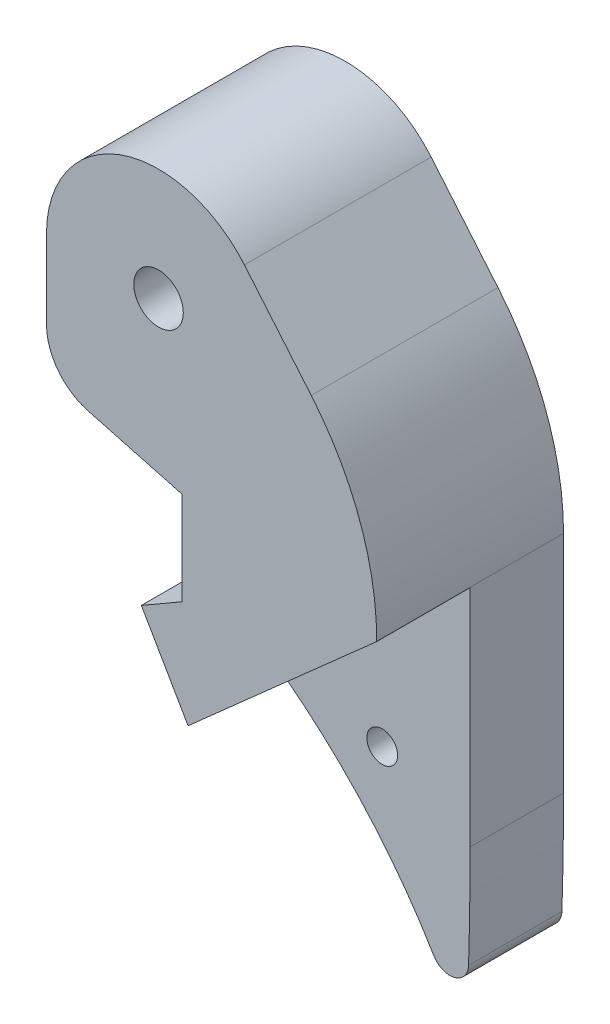
ISO-10303-21;
HEADER;
FILE_DESCRIPTION(('STEP AP214'),'2;1');
FILE_NAME('part.step','',(''),(''),'','','');
FILE_SCHEMA(('AUTOMOTIVE_DESIGN { 1 0 10303 214 1 1 1 1 }'));
ENDSEC;
DATA;
#1=APPLICATION_CONTEXT('core data for automotive mechanical design processes');
#2=APPLICATION_PROTOCOL_DEFINITION('international standard','automotive_design',2000,#1);
#3=PRODUCT_CONTEXT('',#1,'mechanical');
#4=PRODUCT('Part','Part','',(#3));
#5=PRODUCT_RELATED_PRODUCT_CATEGORY('part','',(#4));
#6=PRODUCT_DEFINITION_FORMATION('','',#4);
#7=PRODUCT_DEFINITION_CONTEXT('part definition',#1,'design');
#8=PRODUCT_DEFINITION('design','',#6,#7);
#9=PRODUCT_DEFINITION_SHAPE('','',#8);
#10=(LENGTH_UNIT() NAMED_UNIT(*) SI_UNIT(.MILLI.,.METRE.));
#11=(NAMED_UNIT(*) PLANE_ANGLE_UNIT() SI_UNIT($,.RADIAN.));
#12=(NAMED_UNIT(*) SI_UNIT($,.STERADIAN.) SOLID_ANGLE_UNIT());
#13=UNCERTAINTY_MEASURE_WITH_UNIT(LENGTH_MEASURE(1.E-05),#10,'distance_accuracy_value','');
#14=(GEOMETRIC_REPRESENTATION_CONTEXT(3) GLOBAL_UNCERTAINTY_ASSIGNED_CONTEXT((#13)) GLOBAL_UNIT_ASSIGNED_CONTEXT((#10,
#11,#12)) REPRESENTATION_CONTEXT('',''));
#15=CARTESIAN_POINT('',(0.,0.,0.));
#16=DIRECTION('',(0.,0.,1.));
#17=DIRECTION('',(1.,0.,0.));
#18=AXIS2_PLACEMENT_3D('',#15,#16,#17);
#19=CARTESIAN_POINT('',(-22.7858285918169,-75.5525852744783,20.));
#20=DIRECTION('',(0.,0.,-1.));
#21=DIRECTION('',(-1.,0.,0.));
#22=AXIS2_PLACEMENT_3D('',#19,#20,#21);
#23=CYLINDRICAL_SURFACE('',#22,63.1748093339037);
#24=CARTESIAN_POINT('',(-22.7858285918169,-75.5525852744783,0.));
#25=DIRECTION('',(0.,0.,-1.));
#26=DIRECTION('',(-1.,0.,0.));
#27=AXIS2_PLACEMENT_3D('',#24,#25,#26);
#28=CIRCLE('',#27,63.1748093339037);
#29=CARTESIAN_POINT('',(15.1587603754139,-25.0425397143821,0.));
#30=VERTEX_POINT('',#29);
#31=CARTESIAN_POINT('',(31.4788245209,-43.2044175221683,0.));
#32=VERTEX_POINT('',#31);
#33=EDGE_CURVE('E205',#30,#32,#28,.T.);
#34=ORIENTED_EDGE('',*,*,#33,.T.);
#35=DIRECTION('',(0.,0.,-1.));
#36=VECTOR('',#35,1.);
#37=CARTESIAN_POINT('',(31.4788245209,-43.2044175221683,20.));
#38=LINE('',#37,#36);
#39=CARTESIAN_POINT('',(31.4788245209,-43.2044175221683,10.));
#40=VERTEX_POINT('',#39);
#41=EDGE_CURVE('E238',#32,#40,#38,.F.);
#42=ORIENTED_EDGE('',*,*,#41,.T.);
#43=CARTESIAN_POINT('',(-22.7858285918169,-75.5525852744783,10.));
#44=DIRECTION('',(0.,0.,1.));
#45=DIRECTION('',(1.,0.,0.));
#46=AXIS2_PLACEMENT_3D('',#43,#44,#45);
#47=CIRCLE('',#46,63.1748093339037);
#48=CARTESIAN_POINT('',(15.1587603754139,-25.0425397143821,10.));
#49=VERTEX_POINT('',#48);
#50=EDGE_CURVE('E167',#49,#40,#47,.F.);
#51=ORIENTED_EDGE('',*,*,#50,.F.);
#52=DIRECTION('',(0.,0.,-1.));
#53=VECTOR('',#52,1.);
#54=CARTESIAN_POINT('',(15.1587603754139,-25.0425397143821,20.));
#55=LINE('',#54,#53);
#56=EDGE_CURVE('E224',#49,#30,#55,.T.);
#57=ORIENTED_EDGE('',*,*,#56,.T.);
#58=EDGE_LOOP('',(#34,#42,#51,#57));
#59=FACE_BOUND('',#58,.T.);
#60=ADVANCED_FACE('F34',(#59),#23,.F.);
#61=CARTESIAN_POINT('',(-325.086787377841,-31.1774179561002,20.));
#62=DIRECTION('',(0.,0.,-1.));
#63=DIRECTION('',(-1.,0.,0.));
#64=AXIS2_PLACEMENT_3D('',#61,#62,#63);
#65=CYLINDRICAL_SURFACE('',#64,360.452442871952);
#66=CARTESIAN_POINT('',(-325.086787377841,-31.1774179561002,10.));
#67=DIRECTION('',(0.,0.,1.));
#68=DIRECTION('',(1.,0.,0.));
#69=AXIS2_PLACEMENT_3D('',#66,#67,#68);
#70=CIRCLE('',#69,360.452442871952);
#71=CARTESIAN_POINT('',(35.1958026765203,-42.2417243545552,10.));
#72=VERTEX_POINT('',#71);
#73=CARTESIAN_POINT('',(35.3656554941111,-31.1774179561002,10.));
#74=VERTEX_POINT('',#73);
#75=EDGE_CURVE('E145',#72,#74,#70,.T.);
#76=ORIENTED_EDGE('',*,*,#75,.F.);
#77=DIRECTION('',(0.,0.,-1.));
#78=VECTOR('',#77,1.);
#79=CARTESIAN_POINT('',(35.1958026765204,-42.2417243545552,20.));
#80=LINE('',#79,#78);
#81=CARTESIAN_POINT('',(35.1958026765203,-42.2417243545552,0.));
#82=VERTEX_POINT('',#81);
#83=EDGE_CURVE('E150',#72,#82,#80,.T.);
#84=ORIENTED_EDGE('',*,*,#83,.T.);
#85=CARTESIAN_POINT('',(-325.086787377841,-31.1774179561002,0.));
#86=DIRECTION('',(0.,0.,1.));
#87=DIRECTION('',(1.,0.,0.));
#88=AXIS2_PLACEMENT_3D('',#85,#86,#87);
#89=CIRCLE('',#88,360.452442871952);
#90=CARTESIAN_POINT('',(35.3656554941111,-31.1774179561002,0.));
#91=VERTEX_POINT('',#90);
#92=EDGE_CURVE('E208',#82,#91,#89,.T.);
#93=ORIENTED_EDGE('',*,*,#92,.T.);
#94=DIRECTION('',(0.,0.,-1.));
#95=VECTOR('',#94,1.);
#96=CARTESIAN_POINT('',(35.3656554941111,-31.1774179561002,20.));
#97=LINE('',#96,#95);
#98=EDGE_CURVE('E222',#74,#91,#97,.T.);
#99=ORIENTED_EDGE('',*,*,#98,.F.);
#100=EDGE_LOOP('',(#76,#84,#93,#99));
#101=FACE_BOUND('',#100,.T.);
#102=ADVANCED_FACE('F284',(#101),#65,.T.);
#103=CARTESIAN_POINT('',(-22.7858285918169,-75.5525852744783,20.));
#104=DIRECTION('',(0.,0.,-1.));
#105=DIRECTION('',(-1.,0.,0.));
#106=AXIS2_PLACEMENT_3D('',#103,#104,#105);
#107=PLANE('',#106);
#108=DIRECTION('',(0.,-1.,0.));
#109=VECTOR('',#108,1.);
#110=CARTESIAN_POINT('',(0.,0.,20.));
#111=LINE('',#110,#109);
#112=CARTESIAN_POINT('',(0.,13.,20.));
#113=VERTEX_POINT('',#112);
#114=CARTESIAN_POINT('',(0.,4.60396192787378,20.));
#115=VERTEX_POINT('',#114);
#116=EDGE_CURVE('E194',#113,#115,#111,.T.);
#117=ORIENTED_EDGE('',*,*,#116,.T.);
#118=CARTESIAN_POINT('',(6.,4.60396192787378,20.));
#119=DIRECTION('',(0.,0.,-1.));
#120=DIRECTION('',(-1.,0.,0.));
#121=AXIS2_PLACEMENT_3D('',#118,#119,#120);
#122=CIRCLE('',#121,6.);
#123=CARTESIAN_POINT('',(4.4470857293849,-1.19159302986064,20.));
#124=VERTEX_POINT('',#123);
#125=EDGE_CURVE('E11',#115,#124,#122,.F.);
#126=ORIENTED_EDGE('',*,*,#125,.T.);
#127=DIRECTION('',(0.965925826289069,-0.258819045102518,0.));
#128=VECTOR('',#127,1.);
#129=CARTESIAN_POINT('',(0.,0.,20.));
#130=LINE('',#129,#128);
#131=CARTESIAN_POINT('',(14.488887394336,-3.88228567653776,20.));
#132=VERTEX_POINT('',#131);
#133=EDGE_CURVE('E179',#124,#132,#130,.T.);
#134=ORIENTED_EDGE('',*,*,#133,.T.);
#135=DIRECTION('',(0.,-1.,0.));
#136=VECTOR('',#135,1.);
#137=CARTESIAN_POINT('',(14.488887394336,-3.88228567653776,20.));
#138=LINE('',#137,#136);
#139=CARTESIAN_POINT('',(14.488887394336,-13.8822856765378,20.));
#140=VERTEX_POINT('',#139);
#141=EDGE_CURVE('E181',#132,#140,#138,.T.);
#142=ORIENTED_EDGE('',*,*,#141,.T.);
#143=DIRECTION('',(-0.866025403784436,-0.500000000000005,0.));
#144=VECTOR('',#143,1.);
#145=CARTESIAN_POINT('',(10.1587603754139,-16.3822856765378,20.));
#146=LINE('',#145,#144);
#147=CARTESIAN_POINT('',(10.1587603754139,-16.3822856765378,20.));
#148=VERTEX_POINT('',#147);
#149=EDGE_CURVE('E184',#140,#148,#146,.T.);
#150=ORIENTED_EDGE('',*,*,#149,.T.);
#151=DIRECTION('',(0.500000000000005,-0.866025403784436,0.));
#152=VECTOR('',#151,1.);
#153=CARTESIAN_POINT('',(10.1587603754139,-16.3822856765378,20.));
#154=LINE('',#153,#152);
#155=CARTESIAN_POINT('',(15.1587603754139,-25.0425397143821,20.));
#156=VERTEX_POINT('',#155);
#157=EDGE_CURVE('E186',#148,#156,#154,.T.);
#158=ORIENTED_EDGE('',*,*,#157,.T.);
#159=DIRECTION('',(-0.748351769758867,-0.663302064446336,0.));
#160=VECTOR('',#159,1.);
#161=CARTESIAN_POINT('',(15.1587603754139,-25.0425397143821,20.));
#162=LINE('',#161,#160);
#163=CARTESIAN_POINT('',(35.3656554941111,-7.13214544538587,20.));
#164=VERTEX_POINT('',#163);
#165=EDGE_CURVE('E159',#164,#156,#162,.T.);
#166=ORIENTED_EDGE('',*,*,#165,.F.);
#167=DIRECTION('',(0.,1.,0.));
#168=VECTOR('',#167,1.);
#169=CARTESIAN_POINT('',(35.3656554941111,-31.1774179561002,20.));
#170=LINE('',#169,#168);
#171=CARTESIAN_POINT('',(35.3656554941111,-7.09652498408647,20.));
#172=VERTEX_POINT('',#171);
#173=EDGE_CURVE('E165',#164,#172,#170,.T.);
#174=ORIENTED_EDGE('',*,*,#173,.T.);
#175=CARTESIAN_POINT('',(5.36565549411108,-7.09652498408647,20.));
#176=DIRECTION('',(0.,0.,-1.));
#177=DIRECTION('',(-1.,0.,0.));
#178=AXIS2_PLACEMENT_3D('',#175,#176,#177);
#179=CIRCLE('',#178,30.);
#180=CARTESIAN_POINT('',(28.3469887876802,12.1871033065099,20.));
#181=VERTEX_POINT('',#180);
#182=EDGE_CURVE('E249',#172,#181,#179,.F.);
#183=ORIENTED_EDGE('',*,*,#182,.T.);
#184=DIRECTION('',(-0.642787609686547,0.766044443118972,0.));
#185=VECTOR('',#184,1.);
#186=CARTESIAN_POINT('',(35.3656554941111,3.82258204389977,20.));
#187=LINE('',#186,#185);
#188=CARTESIAN_POINT('',(21.1925333174277,20.7134513162386,20.));
#189=VERTEX_POINT('',#188);
#190=EDGE_CURVE('E190',#181,#189,#187,.T.);
#191=ORIENTED_EDGE('',*,*,#190,.T.);
#192=CARTESIAN_POINT('',(12.,13.,20.));
#193=DIRECTION('',(0.,0.,1.));
#194=DIRECTION('',(-1.,0.,0.));
#195=AXIS2_PLACEMENT_3D('',#192,#193,#194);
#196=CIRCLE('',#195,12.);
#197=EDGE_CURVE('E192',#189,#113,#196,.T.);
#198=ORIENTED_EDGE('',*,*,#197,.T.);
#199=EDGE_LOOP('',(#117,#126,#134,#142,#150,#158,#166,#174,#183,#191,#198));
#200=FACE_BOUND('',#199,.T.);
#201=CARTESIAN_POINT('',(12.,13.,20.));
#202=DIRECTION('',(0.,0.,1.));
#203=DIRECTION('',(1.,0.,0.));
#204=AXIS2_PLACEMENT_3D('',#201,#202,#203);
#205=CIRCLE('',#204,2.65);
#206=CARTESIAN_POINT('',(14.65,13.,20.));
#207=VERTEX_POINT('',#206);
#208=EDGE_CURVE('E173',#207,#207,#205,.T.);
#209=ORIENTED_EDGE('',*,*,#208,.F.);
#210=EDGE_LOOP('',(#209));
#211=FACE_BOUND('',#210,.T.);
#212=ADVANCED_FACE('F272',(#200,#211),#107,.F.);
#213=CARTESIAN_POINT('',(-22.7858285918169,-75.5525852744783,0.));
#214=DIRECTION('',(0.,0.,-1.));
#215=DIRECTION('',(-1.,0.,0.));
#216=AXIS2_PLACEMENT_3D('',#213,#214,#215);
#217=PLANE('',#216);
#218=CARTESIAN_POINT('',(25.9500487097739,-26.5816192697059,0.));
#219=DIRECTION('',(0.,0.,1.));
#220=DIRECTION('',(1.,0.,0.));
#221=AXIS2_PLACEMENT_3D('',#218,#219,#220);
#222=CIRCLE('',#221,1.65);
#223=CARTESIAN_POINT('',(27.6000487097739,-26.5816192697059,0.));
#224=VERTEX_POINT('',#223);
#225=EDGE_CURVE('E445',#224,#224,#222,.T.);
#226=ORIENTED_EDGE('',*,*,#225,.T.);
#227=EDGE_LOOP('',(#226));
#228=FACE_BOUND('',#227,.T.);
#229=DIRECTION('',(0.965925826289069,-0.258819045102518,0.));
#230=VECTOR('',#229,1.);
#231=CARTESIAN_POINT('',(0.,0.,0.));
#232=LINE('',#231,#230);
#233=CARTESIAN_POINT('',(4.4470857293849,-1.19159302986064,0.));
#234=VERTEX_POINT('',#233);
#235=CARTESIAN_POINT('',(14.488887394336,-3.88228567653776,0.));
#236=VERTEX_POINT('',#235);
#237=EDGE_CURVE('E176',#234,#236,#232,.T.);
#238=ORIENTED_EDGE('',*,*,#237,.F.);
#239=CARTESIAN_POINT('',(6.,4.60396192787378,0.));
#240=DIRECTION('',(0.,0.,-1.));
#241=DIRECTION('',(-1.,0.,0.));
#242=AXIS2_PLACEMENT_3D('',#239,#240,#241);
#243=CIRCLE('',#242,6.);
#244=CARTESIAN_POINT('',(0.,4.60396192787378,0.));
#245=VERTEX_POINT('',#244);
#246=EDGE_CURVE('E56',#234,#245,#243,.T.);
#247=ORIENTED_EDGE('',*,*,#246,.T.);
#248=DIRECTION('',(0.,-1.,0.));
#249=VECTOR('',#248,1.);
#250=CARTESIAN_POINT('',(0.,0.,0.));
#251=LINE('',#250,#249);
#252=CARTESIAN_POINT('',(0.,13.,0.));
#253=VERTEX_POINT('',#252);
#254=EDGE_CURVE('E182',#253,#245,#251,.T.);
#255=ORIENTED_EDGE('',*,*,#254,.F.);
#256=CARTESIAN_POINT('',(12.,13.,0.));
#257=DIRECTION('',(0.,0.,1.));
#258=DIRECTION('',(-1.,0.,0.));
#259=AXIS2_PLACEMENT_3D('',#256,#257,#258);
#260=CIRCLE('',#259,12.);
#261=CARTESIAN_POINT('',(21.1925333174277,20.7134513162386,0.));
#262=VERTEX_POINT('',#261);
#263=EDGE_CURVE('E214',#262,#253,#260,.T.);
#264=ORIENTED_EDGE('',*,*,#263,.F.);
#265=DIRECTION('',(-0.642787609686547,0.766044443118972,0.));
#266=VECTOR('',#265,1.);
#267=CARTESIAN_POINT('',(35.3656554941111,3.82258204389977,0.));
#268=LINE('',#267,#266);
#269=CARTESIAN_POINT('',(28.3469887876802,12.1871033065099,0.));
#270=VERTEX_POINT('',#269);
#271=EDGE_CURVE('E212',#270,#262,#268,.T.);
#272=ORIENTED_EDGE('',*,*,#271,.F.);
#273=CARTESIAN_POINT('',(5.36565549411108,-7.09652498408647,0.));
#274=DIRECTION('',(0.,0.,-1.));
#275=DIRECTION('',(-1.,0.,0.));
#276=AXIS2_PLACEMENT_3D('',#273,#274,#275);
#277=CIRCLE('',#276,30.);
#278=CARTESIAN_POINT('',(35.3656554941111,-7.09652498408647,0.));
#279=VERTEX_POINT('',#278);
#280=EDGE_CURVE('E245',#270,#279,#277,.T.);
#281=ORIENTED_EDGE('',*,*,#280,.T.);
#282=DIRECTION('',(0.,1.,0.));
#283=VECTOR('',#282,1.);
#284=CARTESIAN_POINT('',(35.3656554941111,-31.1774179561002,0.));
#285=LINE('',#284,#283);
#286=EDGE_CURVE('E210',#91,#279,#285,.T.);
#287=ORIENTED_EDGE('',*,*,#286,.F.);
#288=ORIENTED_EDGE('',*,*,#92,.F.);
#289=CARTESIAN_POINT('',(33.1967451188366,-42.1803331412773,0.));
#290=DIRECTION('',(0.,0.,-1.));
#291=DIRECTION('',(-1.,0.,0.));
#292=AXIS2_PLACEMENT_3D('',#289,#290,#291);
#293=CIRCLE('',#292,2.);
#294=EDGE_CURVE('E236',#82,#32,#293,.T.);
#295=ORIENTED_EDGE('',*,*,#294,.T.);
#296=ORIENTED_EDGE('',*,*,#33,.F.);
#297=DIRECTION('',(0.500000000000005,-0.866025403784436,0.));
#298=VECTOR('',#297,1.);
#299=CARTESIAN_POINT('',(10.1587603754139,-16.3822856765378,0.));
#300=LINE('',#299,#298);
#301=CARTESIAN_POINT('',(10.1587603754139,-16.3822856765378,0.));
#302=VERTEX_POINT('',#301);
#303=EDGE_CURVE('E202',#302,#30,#300,.T.);
#304=ORIENTED_EDGE('',*,*,#303,.F.);
#305=DIRECTION('',(-0.866025403784436,-0.500000000000005,0.));
#306=VECTOR('',#305,1.);
#307=CARTESIAN_POINT('',(10.1587603754139,-16.3822856765378,0.));
#308=LINE('',#307,#306);
#309=CARTESIAN_POINT('',(14.488887394336,-13.8822856765378,0.));
#310=VERTEX_POINT('',#309);
#311=EDGE_CURVE('E200',#310,#302,#308,.T.);
#312=ORIENTED_EDGE('',*,*,#311,.F.);
#313=DIRECTION('',(0.,-1.,0.));
#314=VECTOR('',#313,1.);
#315=CARTESIAN_POINT('',(14.488887394336,-3.88228567653776,0.));
#316=LINE('',#315,#314);
#317=EDGE_CURVE('E198',#236,#310,#316,.T.);
#318=ORIENTED_EDGE('',*,*,#317,.F.);
#319=EDGE_LOOP('',(#238,#247,#255,#264,#272,#281,#287,#288,#295,#296,#304,#312,#318));
#320=FACE_BOUND('',#319,.T.);
#321=CARTESIAN_POINT('',(12.,13.,0.));
#322=DIRECTION('',(0.,0.,1.));
#323=DIRECTION('',(1.,0.,0.));
#324=AXIS2_PLACEMENT_3D('',#321,#322,#323);
#325=CIRCLE('',#324,2.65);
#326=CARTESIAN_POINT('',(14.65,13.,0.));
#327=VERTEX_POINT('',#326);
#328=EDGE_CURVE('E172',#327,#327,#325,.T.);
#329=ORIENTED_EDGE('',*,*,#328,.T.);
#330=EDGE_LOOP('',(#329));
#331=FACE_BOUND('',#330,.T.);
#332=ADVANCED_FACE('F262',(#228,#320,#331),#217,.T.);
#333=CARTESIAN_POINT('',(0.,0.,20.));
#334=DIRECTION('',(0.258819045102518,0.965925826289069,0.));
#335=DIRECTION('',(-0.965925826289069,0.258819045102518,0.));
#336=AXIS2_PLACEMENT_3D('',#333,#334,#335);
#337=PLANE('',#336);
#338=ORIENTED_EDGE('',*,*,#133,.F.);
#339=DIRECTION('',(0.,0.,-1.));
#340=VECTOR('',#339,1.);
#341=CARTESIAN_POINT('',(4.44708572938489,-1.19159302986064,20.));
#342=LINE('',#341,#340);
#343=EDGE_CURVE('E251',#124,#234,#342,.T.);
#344=ORIENTED_EDGE('',*,*,#343,.T.);
#345=ORIENTED_EDGE('',*,*,#237,.T.);
#346=DIRECTION('',(0.,0.,-1.));
#347=VECTOR('',#346,1.);
#348=CARTESIAN_POINT('',(14.488887394336,-3.88228567653776,20.));
#349=LINE('',#348,#347);
#350=EDGE_CURVE('E151',#132,#236,#349,.T.);
#351=ORIENTED_EDGE('',*,*,#350,.F.);
#352=EDGE_LOOP('',(#338,#344,#345,#351));
#353=FACE_BOUND('',#352,.T.);
#354=ADVANCED_FACE('F257',(#353),#337,.F.);
#355=CARTESIAN_POINT('',(14.488887394336,-3.88228567653776,20.));
#356=DIRECTION('',(1.,0.,0.));
#357=DIRECTION('',(0.,0.,-1.));
#358=AXIS2_PLACEMENT_3D('',#355,#356,#357);
#359=PLANE('',#358);
#360=ORIENTED_EDGE('',*,*,#317,.T.);
#361=DIRECTION('',(0.,0.,-1.));
#362=VECTOR('',#361,1.);
#363=CARTESIAN_POINT('',(14.488887394336,-13.8822856765378,20.));
#364=LINE('',#363,#362);
#365=EDGE_CURVE('E229',#140,#310,#364,.T.);
#366=ORIENTED_EDGE('',*,*,#365,.F.);
#367=ORIENTED_EDGE('',*,*,#141,.F.);
#368=ORIENTED_EDGE('',*,*,#350,.T.);
#369=EDGE_LOOP('',(#360,#366,#367,#368));
#370=FACE_BOUND('',#369,.T.);
#371=ADVANCED_FACE('F269',(#370),#359,.F.);
#372=CARTESIAN_POINT('',(10.1587603754139,-16.3822856765378,20.));
#373=DIRECTION('',(0.500000000000005,-0.866025403784436,0.));
#374=DIRECTION('',(0.866025403784436,0.500000000000005,0.));
#375=AXIS2_PLACEMENT_3D('',#372,#373,#374);
#376=PLANE('',#375);
#377=ORIENTED_EDGE('',*,*,#311,.T.);
#378=DIRECTION('',(0.,0.,-1.));
#379=VECTOR('',#378,1.);
#380=CARTESIAN_POINT('',(10.1587603754139,-16.3822856765378,20.));
#381=LINE('',#380,#379);
#382=EDGE_CURVE('E226',#148,#302,#381,.T.);
#383=ORIENTED_EDGE('',*,*,#382,.F.);
#384=ORIENTED_EDGE('',*,*,#149,.F.);
#385=ORIENTED_EDGE('',*,*,#365,.T.);
#386=EDGE_LOOP('',(#377,#383,#384,#385));
#387=FACE_BOUND('',#386,.T.);
#388=ADVANCED_FACE('F297',(#387),#376,.F.);
#389=CARTESIAN_POINT('',(10.1587603754139,-16.3822856765378,20.));
#390=DIRECTION('',(0.866025403784436,0.500000000000005,0.));
#391=DIRECTION('',(-0.500000000000005,0.866025403784436,0.));
#392=AXIS2_PLACEMENT_3D('',#389,#390,#391);
#393=PLANE('',#392);
#394=ORIENTED_EDGE('',*,*,#303,.T.);
#395=ORIENTED_EDGE('',*,*,#56,.F.);
#396=EDGE_CURVE('E158',#156,#49,#55,.T.);
#397=ORIENTED_EDGE('',*,*,#396,.F.);
#398=ORIENTED_EDGE('',*,*,#157,.F.);
#399=ORIENTED_EDGE('',*,*,#382,.T.);
#400=EDGE_LOOP('',(#394,#395,#397,#398,#399));
#401=FACE_BOUND('',#400,.T.);
#402=ADVANCED_FACE('F294',(#401),#393,.F.);
#403=CARTESIAN_POINT('',(35.3656554941111,-31.1774179561002,20.));
#404=DIRECTION('',(-1.,0.,0.));
#405=DIRECTION('',(0.,0.,1.));
#406=AXIS2_PLACEMENT_3D('',#403,#404,#405);
#407=PLANE('',#406);
#408=ORIENTED_EDGE('',*,*,#286,.T.);
#409=DIRECTION('',(0.,0.,-1.));
#410=VECTOR('',#409,1.);
#411=CARTESIAN_POINT('',(35.3656554941111,-7.09652498408647,20.));
#412=LINE('',#411,#410);
#413=EDGE_CURVE('E247',#279,#172,#412,.F.);
#414=ORIENTED_EDGE('',*,*,#413,.T.);
#415=ORIENTED_EDGE('',*,*,#173,.F.);
#416=DIRECTION('',(0.,0.,1.));
#417=VECTOR('',#416,1.);
#418=CARTESIAN_POINT('',(35.3656554941111,-7.13214544538587,10.));
#419=LINE('',#418,#417);
#420=CARTESIAN_POINT('',(35.3656554941111,-7.13214544538587,10.));
#421=VERTEX_POINT('',#420);
#422=EDGE_CURVE('E155',#421,#164,#419,.T.);
#423=ORIENTED_EDGE('',*,*,#422,.F.);
#424=DIRECTION('',(0.,1.,0.));
#425=VECTOR('',#424,1.);
#426=CARTESIAN_POINT('',(35.3656554941111,-31.1774179561002,10.));
#427=LINE('',#426,#425);
#428=EDGE_CURVE('E138',#74,#421,#427,.T.);
#429=ORIENTED_EDGE('',*,*,#428,.F.);
#430=ORIENTED_EDGE('',*,*,#98,.T.);
#431=EDGE_LOOP('',(#408,#414,#415,#423,#429,#430));
#432=FACE_BOUND('',#431,.T.);
#433=ADVANCED_FACE('F163',(#432),#407,.F.);
#434=CARTESIAN_POINT('',(35.3656554941111,3.82258204389977,20.));
#435=DIRECTION('',(-0.766044443118972,-0.642787609686547,0.));
#436=DIRECTION('',(0.642787609686547,-0.766044443118972,0.));
#437=AXIS2_PLACEMENT_3D('',#434,#435,#436);
#438=PLANE('',#437);
#439=ORIENTED_EDGE('',*,*,#190,.F.);
#440=DIRECTION('',(0.,0.,-1.));
#441=VECTOR('',#440,1.);
#442=CARTESIAN_POINT('',(28.3469887876802,12.1871033065099,20.));
#443=LINE('',#442,#441);
#444=EDGE_CURVE('E242',#181,#270,#443,.T.);
#445=ORIENTED_EDGE('',*,*,#444,.T.);
#446=ORIENTED_EDGE('',*,*,#271,.T.);
#447=DIRECTION('',(0.,0.,-1.));
#448=VECTOR('',#447,1.);
#449=CARTESIAN_POINT('',(21.1925333174277,20.7134513162386,20.));
#450=LINE('',#449,#448);
#451=EDGE_CURVE('E219',#189,#262,#450,.T.);
#452=ORIENTED_EDGE('',*,*,#451,.F.);
#453=EDGE_LOOP('',(#439,#445,#446,#452));
#454=FACE_BOUND('',#453,.T.);
#455=ADVANCED_FACE('F319',(#454),#438,.F.);
#456=CARTESIAN_POINT('',(12.,13.,20.));
#457=DIRECTION('',(0.,0.,-1.));
#458=DIRECTION('',(-1.,0.,0.));
#459=AXIS2_PLACEMENT_3D('',#456,#457,#458);
#460=CYLINDRICAL_SURFACE('',#459,12.);
#461=ORIENTED_EDGE('',*,*,#263,.T.);
#462=DIRECTION('',(0.,0.,-1.));
#463=VECTOR('',#462,1.);
#464=CARTESIAN_POINT('',(0.,13.,20.));
#465=LINE('',#464,#463);
#466=EDGE_CURVE('E196',#113,#253,#465,.T.);
#467=ORIENTED_EDGE('',*,*,#466,.F.);
#468=ORIENTED_EDGE('',*,*,#197,.F.);
#469=ORIENTED_EDGE('',*,*,#451,.T.);
#470=EDGE_LOOP('',(#461,#467,#468,#469));
#471=FACE_BOUND('',#470,.T.);
#472=ADVANCED_FACE('F325',(#471),#460,.T.);
#473=CARTESIAN_POINT('',(0.,0.,20.));
#474=DIRECTION('',(1.,0.,0.));
#475=DIRECTION('',(0.,0.,-1.));
#476=AXIS2_PLACEMENT_3D('',#473,#474,#475);
#477=PLANE('',#476);
#478=ORIENTED_EDGE('',*,*,#254,.T.);
#479=DIRECTION('',(0.,0.,-1.));
#480=VECTOR('',#479,1.);
#481=CARTESIAN_POINT('',(0.,4.60396192787378,20.));
#482=LINE('',#481,#480);
#483=EDGE_CURVE('E42',#245,#115,#482,.F.);
#484=ORIENTED_EDGE('',*,*,#483,.T.);
#485=ORIENTED_EDGE('',*,*,#116,.F.);
#486=ORIENTED_EDGE('',*,*,#466,.T.);
#487=EDGE_LOOP('',(#478,#484,#485,#486));
#488=FACE_BOUND('',#487,.T.);
#489=ADVANCED_FACE('F326',(#488),#477,.F.);
#490=CARTESIAN_POINT('',(12.,13.,20.));
#491=DIRECTION('',(0.,0.,-1.));
#492=DIRECTION('',(-1.,0.,0.));
#493=AXIS2_PLACEMENT_3D('',#490,#491,#492);
#494=CYLINDRICAL_SURFACE('',#493,2.65);
#495=ORIENTED_EDGE('',*,*,#208,.T.);
#496=EDGE_LOOP('',(#495));
#497=FACE_BOUND('',#496,.T.);
#498=ORIENTED_EDGE('',*,*,#328,.F.);
#499=EDGE_LOOP('',(#498));
#500=FACE_BOUND('',#499,.T.);
#501=ADVANCED_FACE('F328',(#497,#500),#494,.F.);
#502=CARTESIAN_POINT('',(0.,0.,10.));
#503=DIRECTION('',(0.,0.,1.));
#504=DIRECTION('',(1.,0.,0.));
#505=AXIS2_PLACEMENT_3D('',#502,#503,#504);
#506=PLANE('',#505);
#507=CARTESIAN_POINT('',(25.9500487097739,-26.5816192697059,10.));
#508=DIRECTION('',(0.,0.,1.));
#509=DIRECTION('',(1.,0.,0.));
#510=AXIS2_PLACEMENT_3D('',#507,#508,#509);
#511=CIRCLE('',#510,1.65);
#512=CARTESIAN_POINT('',(27.6000487097739,-26.5816192697059,10.));
#513=VERTEX_POINT('',#512);
#514=EDGE_CURVE('E443',#513,#513,#511,.T.);
#515=ORIENTED_EDGE('',*,*,#514,.F.);
#516=EDGE_LOOP('',(#515));
#517=FACE_BOUND('',#516,.T.);
#518=ORIENTED_EDGE('',*,*,#50,.T.);
#519=CARTESIAN_POINT('',(33.1967451188366,-42.1803331412773,10.));
#520=DIRECTION('',(0.,0.,1.));
#521=DIRECTION('',(1.,0.,0.));
#522=AXIS2_PLACEMENT_3D('',#519,#520,#521);
#523=CIRCLE('',#522,2.);
#524=EDGE_CURVE('E240',#40,#72,#523,.T.);
#525=ORIENTED_EDGE('',*,*,#524,.T.);
#526=ORIENTED_EDGE('',*,*,#75,.T.);
#527=ORIENTED_EDGE('',*,*,#428,.T.);
#528=DIRECTION('',(-0.748351769758867,-0.663302064446336,0.));
#529=VECTOR('',#528,1.);
#530=CARTESIAN_POINT('',(15.1587603754139,-25.0425397143821,10.));
#531=LINE('',#530,#529);
#532=EDGE_CURVE('E142',#421,#49,#531,.T.);
#533=ORIENTED_EDGE('',*,*,#532,.T.);
#534=EDGE_LOOP('',(#518,#525,#526,#527,#533));
#535=FACE_BOUND('',#534,.T.);
#536=ADVANCED_FACE('F141',(#517,#535),#506,.T.);
#537=CARTESIAN_POINT('',(15.1587603754139,-25.0425397143821,10.));
#538=DIRECTION('',(-0.663302064446336,0.748351769758867,0.));
#539=DIRECTION('',(-0.748351769758867,-0.663302064446336,0.));
#540=AXIS2_PLACEMENT_3D('',#537,#538,#539);
#541=PLANE('',#540);
#542=ORIENTED_EDGE('',*,*,#165,.T.);
#543=ORIENTED_EDGE('',*,*,#396,.T.);
#544=ORIENTED_EDGE('',*,*,#532,.F.);
#545=ORIENTED_EDGE('',*,*,#422,.T.);
#546=EDGE_LOOP('',(#542,#543,#544,#545));
#547=FACE_BOUND('',#546,.T.);
#548=ADVANCED_FACE('F154',(#547),#541,.F.);
#549=CARTESIAN_POINT('',(33.1967451188366,-42.1803331412773,20.));
#550=DIRECTION('',(0.,0.,1.));
#551=DIRECTION('',(1.,0.,0.));
#552=AXIS2_PLACEMENT_3D('',#549,#550,#551);
#553=CYLINDRICAL_SURFACE('',#552,2.);
#554=ORIENTED_EDGE('',*,*,#524,.F.);
#555=ORIENTED_EDGE('',*,*,#41,.F.);
#556=ORIENTED_EDGE('',*,*,#294,.F.);
#557=ORIENTED_EDGE('',*,*,#83,.F.);
#558=EDGE_LOOP('',(#554,#555,#556,#557));
#559=FACE_BOUND('',#558,.T.);
#560=ADVANCED_FACE('F306',(#559),#553,.T.);
#561=CARTESIAN_POINT('',(5.36565549411108,-7.09652498408647,20.));
#562=DIRECTION('',(0.,0.,-1.));
#563=DIRECTION('',(-1.,0.,0.));
#564=AXIS2_PLACEMENT_3D('',#561,#562,#563);
#565=CYLINDRICAL_SURFACE('',#564,30.);
#566=ORIENTED_EDGE('',*,*,#182,.F.);
#567=ORIENTED_EDGE('',*,*,#413,.F.);
#568=ORIENTED_EDGE('',*,*,#280,.F.);
#569=ORIENTED_EDGE('',*,*,#444,.F.);
#570=EDGE_LOOP('',(#566,#567,#568,#569));
#571=FACE_BOUND('',#570,.T.);
#572=ADVANCED_FACE('F280',(#571),#565,.T.);
#573=CARTESIAN_POINT('',(25.9500487097739,-26.5816192697059,0.));
#574=DIRECTION('',(0.,0.,1.));
#575=DIRECTION('',(1.,0.,0.));
#576=AXIS2_PLACEMENT_3D('',#573,#574,#575);
#577=CYLINDRICAL_SURFACE('',#576,1.65);
#578=ORIENTED_EDGE('',*,*,#225,.F.);
#579=EDGE_LOOP('',(#578));
#580=FACE_BOUND('',#579,.T.);
#581=ORIENTED_EDGE('',*,*,#514,.T.);
#582=EDGE_LOOP('',(#581));
#583=FACE_BOUND('',#582,.T.);
#584=ADVANCED_FACE('F276',(#580,#583),#577,.F.);
#585=CARTESIAN_POINT('',(6.,4.60396192787378,20.));
#586=DIRECTION('',(0.,0.,-1.));
#587=DIRECTION('',(-1.,0.,0.));
#588=AXIS2_PLACEMENT_3D('',#585,#586,#587);
#589=CYLINDRICAL_SURFACE('',#588,6.);
#590=ORIENTED_EDGE('',*,*,#125,.F.);
#591=ORIENTED_EDGE('',*,*,#483,.F.);
#592=ORIENTED_EDGE('',*,*,#246,.F.);
#593=ORIENTED_EDGE('',*,*,#343,.F.);
#594=EDGE_LOOP('',(#590,#591,#592,#593));
#595=FACE_BOUND('',#594,.T.);
#596=ADVANCED_FACE('F36',(#595),#589,.T.);
#597=CLOSED_SHELL('',(#60,#102,#212,#332,#354,#371,#388,#402,#433,#455,#472,#489,#501,#536,#548,
#560,#572,#584,#596));
#598=MANIFOLD_SOLID_BREP('B2',#597);
#599=ADVANCED_BREP_SHAPE_REPRESENTATION('',(#18,#598),#14);
#600=SHAPE_DEFINITION_REPRESENTATION(#9,#599);
ENDSEC;
END-ISO-10303-21;
